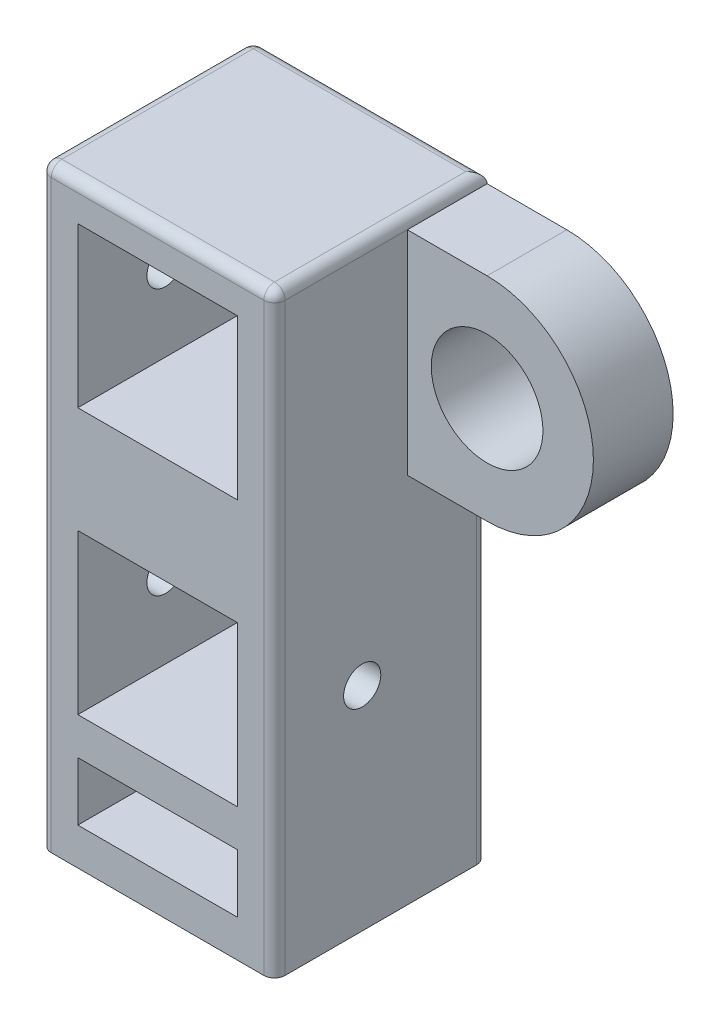
ISO-10303-21;
HEADER;
FILE_DESCRIPTION(('STEP AP214'),'2;1');
FILE_NAME('part.step','',(''),(''),'','','');
FILE_SCHEMA(('AUTOMOTIVE_DESIGN { 1 0 10303 214 1 1 1 1 }'));
ENDSEC;
DATA;
#1=APPLICATION_CONTEXT('core data for automotive mechanical design processes');
#2=APPLICATION_PROTOCOL_DEFINITION('international standard','automotive_design',2000,#1);
#3=PRODUCT_CONTEXT('',#1,'mechanical');
#4=PRODUCT('Part','Part','',(#3));
#5=PRODUCT_RELATED_PRODUCT_CATEGORY('part','',(#4));
#6=PRODUCT_DEFINITION_FORMATION('','',#4);
#7=PRODUCT_DEFINITION_CONTEXT('part definition',#1,'design');
#8=PRODUCT_DEFINITION('design','',#6,#7);
#9=PRODUCT_DEFINITION_SHAPE('','',#8);
#10=(LENGTH_UNIT() NAMED_UNIT(*) SI_UNIT(.MILLI.,.METRE.));
#11=(NAMED_UNIT(*) PLANE_ANGLE_UNIT() SI_UNIT($,.RADIAN.));
#12=(NAMED_UNIT(*) SI_UNIT($,.STERADIAN.) SOLID_ANGLE_UNIT());
#13=UNCERTAINTY_MEASURE_WITH_UNIT(LENGTH_MEASURE(1.E-05),#10,'distance_accuracy_value','');
#14=(GEOMETRIC_REPRESENTATION_CONTEXT(3) GLOBAL_UNCERTAINTY_ASSIGNED_CONTEXT((#13)) GLOBAL_UNIT_ASSIGNED_CONTEXT((#10,
#11,#12)) REPRESENTATION_CONTEXT('',''));
#15=CARTESIAN_POINT('',(0.,0.,0.));
#16=DIRECTION('',(0.,0.,1.));
#17=DIRECTION('',(1.,0.,0.));
#18=AXIS2_PLACEMENT_3D('',#15,#16,#17);
#19=CARTESIAN_POINT('',(-3.09617260414297,42.3339477261805,20.));
#20=DIRECTION('',(-1.,0.,0.));
#21=DIRECTION('',(0.,-1.,0.));
#22=AXIS2_PLACEMENT_3D('',#19,#20,#21);
#23=PLANE('',#22);
#24=CARTESIAN_POINT('',(-3.09617260414296,6.33394772618054,11.75));
#25=DIRECTION('',(1.,0.,0.));
#26=DIRECTION('',(0.,1.,0.));
#27=AXIS2_PLACEMENT_3D('',#24,#25,#26);
#28=CIRCLE('',#27,1.75);
#29=CARTESIAN_POINT('',(-3.09617260414296,8.08394772618054,11.75));
#30=VERTEX_POINT('',#29);
#31=EDGE_CURVE('E350',#30,#30,#28,.T.);
#32=ORIENTED_EDGE('',*,*,#31,.F.);
#33=EDGE_LOOP('',(#32));
#34=FACE_BOUND('',#33,.T.);
#35=DIRECTION('',(0.,0.,-1.));
#36=VECTOR('',#35,1.);
#37=CARTESIAN_POINT('',(-3.09617260414296,-13.6660522738195,20.));
#38=LINE('',#37,#36);
#39=CARTESIAN_POINT('',(-3.09617260414296,-13.6660522738195,19.));
#40=VERTEX_POINT('',#39);
#41=CARTESIAN_POINT('',(-3.09617260414296,-13.6660522738195,1.));
#42=VERTEX_POINT('',#41);
#43=EDGE_CURVE('E448',#40,#42,#38,.T.);
#44=ORIENTED_EDGE('',*,*,#43,.T.);
#45=DIRECTION('',(0.,1.,0.));
#46=VECTOR('',#45,1.);
#47=CARTESIAN_POINT('',(-3.09617260414297,42.3339477261805,1.));
#48=LINE('',#47,#46);
#49=CARTESIAN_POINT('',(-3.09617260414296,21.3339477261805,1.));
#50=VERTEX_POINT('',#49);
#51=EDGE_CURVE('E269',#42,#50,#48,.T.);
#52=ORIENTED_EDGE('',*,*,#51,.T.);
#53=DIRECTION('',(0.,0.,-1.));
#54=VECTOR('',#53,1.);
#55=CARTESIAN_POINT('',(-3.09617260414296,21.3339477261805,7.5));
#56=LINE('',#55,#54);
#57=CARTESIAN_POINT('',(-3.09617260414296,21.3339477261805,7.5));
#58=VERTEX_POINT('',#57);
#59=EDGE_CURVE('E221',#58,#50,#56,.T.);
#60=ORIENTED_EDGE('',*,*,#59,.F.);
#61=DIRECTION('',(0.,1.,0.));
#62=VECTOR('',#61,1.);
#63=CARTESIAN_POINT('',(-3.09617260414297,41.3339477261805,7.5));
#64=LINE('',#63,#62);
#65=CARTESIAN_POINT('',(-3.09617260414297,41.3339477261805,7.5));
#66=VERTEX_POINT('',#65);
#67=EDGE_CURVE('E231',#58,#66,#64,.T.);
#68=ORIENTED_EDGE('',*,*,#67,.T.);
#69=DIRECTION('',(0.,0.,-1.));
#70=VECTOR('',#69,1.);
#71=CARTESIAN_POINT('',(-3.09617260414297,41.3339477261805,20.));
#72=LINE('',#71,#70);
#73=CARTESIAN_POINT('',(-3.09617260414297,41.3339477261805,19.));
#74=VERTEX_POINT('',#73);
#75=EDGE_CURVE('E264',#66,#74,#72,.F.);
#76=ORIENTED_EDGE('',*,*,#75,.T.);
#77=DIRECTION('',(0.,1.,0.));
#78=VECTOR('',#77,1.);
#79=CARTESIAN_POINT('',(-3.09617260414296,-13.6660522738195,19.));
#80=LINE('',#79,#78);
#81=EDGE_CURVE('E266',#74,#40,#80,.F.);
#82=ORIENTED_EDGE('',*,*,#81,.T.);
#83=EDGE_LOOP('',(#44,#52,#60,#68,#76,#82));
#84=FACE_BOUND('',#83,.T.);
#85=ADVANCED_FACE('F35',(#34,#84),#23,.F.);
#86=CARTESIAN_POINT('',(0.,0.,20.));
#87=DIRECTION('',(0.,0.,1.));
#88=DIRECTION('',(1.,0.,0.));
#89=AXIS2_PLACEMENT_3D('',#86,#87,#88);
#90=PLANE('',#89);
#91=DIRECTION('',(1.,0.,0.));
#92=VECTOR('',#91,1.);
#93=CARTESIAN_POINT('',(-25.096172604143,-13.6660522738195,20.));
#94=LINE('',#93,#92);
#95=CARTESIAN_POINT('',(-24.096172604143,-13.6660522738195,20.));
#96=VERTEX_POINT('',#95);
#97=CARTESIAN_POINT('',(-4.09617260414296,-13.6660522738195,20.));
#98=VERTEX_POINT('',#97);
#99=EDGE_CURVE('E444',#96,#98,#94,.T.);
#100=ORIENTED_EDGE('',*,*,#99,.T.);
#101=DIRECTION('',(0.,1.,0.));
#102=VECTOR('',#101,1.);
#103=CARTESIAN_POINT('',(-4.09617260414297,42.3339477261805,20.));
#104=LINE('',#103,#102);
#105=CARTESIAN_POINT('',(-4.09617260414297,41.3339477261805,20.));
#106=VERTEX_POINT('',#105);
#107=EDGE_CURVE('E292',#98,#106,#104,.T.);
#108=ORIENTED_EDGE('',*,*,#107,.T.);
#109=DIRECTION('',(-1.,0.,0.));
#110=VECTOR('',#109,1.);
#111=CARTESIAN_POINT('',(-25.096172604143,41.3339477261805,20.));
#112=LINE('',#111,#110);
#113=CARTESIAN_POINT('',(-24.096172604143,41.3339477261805,20.));
#114=VERTEX_POINT('',#113);
#115=EDGE_CURVE('E288',#106,#114,#112,.T.);
#116=ORIENTED_EDGE('',*,*,#115,.T.);
#117=DIRECTION('',(0.,-1.,0.));
#118=VECTOR('',#117,1.);
#119=CARTESIAN_POINT('',(-24.096172604143,-13.6660522738195,20.));
#120=LINE('',#119,#118);
#121=EDGE_CURVE('E290',#114,#96,#120,.T.);
#122=ORIENTED_EDGE('',*,*,#121,.T.);
#123=EDGE_LOOP('',(#100,#108,#116,#122));
#124=FACE_BOUND('',#123,.T.);
#125=DIRECTION('',(0.,-1.,0.));
#126=VECTOR('',#125,1.);
#127=CARTESIAN_POINT('',(-21.596172604143,-4.66605227381946,20.));
#128=LINE('',#127,#126);
#129=CARTESIAN_POINT('',(-21.596172604143,-4.66605227381946,20.));
#130=VERTEX_POINT('',#129);
#131=CARTESIAN_POINT('',(-21.596172604143,-10.1660522738195,20.));
#132=VERTEX_POINT('',#131);
#133=EDGE_CURVE('E249',#130,#132,#128,.T.);
#134=ORIENTED_EDGE('',*,*,#133,.F.);
#135=DIRECTION('',(-1.,0.,0.));
#136=VECTOR('',#135,1.);
#137=CARTESIAN_POINT('',(-21.596172604143,-4.66605227381946,20.));
#138=LINE('',#137,#136);
#139=CARTESIAN_POINT('',(-6.59617260414296,-4.66605227381946,20.));
#140=VERTEX_POINT('',#139);
#141=EDGE_CURVE('E522',#140,#130,#138,.T.);
#142=ORIENTED_EDGE('',*,*,#141,.F.);
#143=DIRECTION('',(0.,1.,0.));
#144=VECTOR('',#143,1.);
#145=CARTESIAN_POINT('',(-6.59617260414296,-4.66605227381946,20.));
#146=LINE('',#145,#144);
#147=CARTESIAN_POINT('',(-6.59617260414296,-10.1660522738195,20.));
#148=VERTEX_POINT('',#147);
#149=EDGE_CURVE('E531',#148,#140,#146,.T.);
#150=ORIENTED_EDGE('',*,*,#149,.F.);
#151=DIRECTION('',(1.,0.,0.));
#152=VECTOR('',#151,1.);
#153=CARTESIAN_POINT('',(-21.596172604143,-10.1660522738195,20.));
#154=LINE('',#153,#152);
#155=EDGE_CURVE('E534',#132,#148,#154,.T.);
#156=ORIENTED_EDGE('',*,*,#155,.F.);
#157=EDGE_LOOP('',(#134,#142,#150,#156));
#158=FACE_BOUND('',#157,.T.);
#159=DIRECTION('',(0.,-1.,0.));
#160=VECTOR('',#159,1.);
#161=CARTESIAN_POINT('',(-21.596172604143,13.8339477261805,20.));
#162=LINE('',#161,#160);
#163=CARTESIAN_POINT('',(-21.596172604143,13.8339477261805,20.));
#164=VERTEX_POINT('',#163);
#165=CARTESIAN_POINT('',(-21.596172604143,-1.16605227381946,20.));
#166=VERTEX_POINT('',#165);
#167=EDGE_CURVE('E509',#164,#166,#162,.T.);
#168=ORIENTED_EDGE('',*,*,#167,.F.);
#169=DIRECTION('',(-1.,0.,0.));
#170=VECTOR('',#169,1.);
#171=CARTESIAN_POINT('',(-21.596172604143,13.8339477261805,20.));
#172=LINE('',#171,#170);
#173=CARTESIAN_POINT('',(-6.59617260414296,13.8339477261805,20.));
#174=VERTEX_POINT('',#173);
#175=EDGE_CURVE('E494',#174,#164,#172,.T.);
#176=ORIENTED_EDGE('',*,*,#175,.F.);
#177=DIRECTION('',(0.,1.,0.));
#178=VECTOR('',#177,1.);
#179=CARTESIAN_POINT('',(-6.59617260414296,13.8339477261805,20.));
#180=LINE('',#179,#178);
#181=CARTESIAN_POINT('',(-6.59617260414296,-1.16605227381946,20.));
#182=VERTEX_POINT('',#181);
#183=EDGE_CURVE('E503',#182,#174,#180,.T.);
#184=ORIENTED_EDGE('',*,*,#183,.F.);
#185=DIRECTION('',(1.,0.,0.));
#186=VECTOR('',#185,1.);
#187=CARTESIAN_POINT('',(-21.596172604143,-1.16605227381946,20.));
#188=LINE('',#187,#186);
#189=EDGE_CURVE('E506',#166,#182,#188,.T.);
#190=ORIENTED_EDGE('',*,*,#189,.F.);
#191=EDGE_LOOP('',(#168,#176,#184,#190));
#192=FACE_BOUND('',#191,.T.);
#193=DIRECTION('',(1.,0.,0.));
#194=VECTOR('',#193,1.);
#195=CARTESIAN_POINT('',(-21.596172604143,23.8339477261805,20.));
#196=LINE('',#195,#194);
#197=CARTESIAN_POINT('',(-21.596172604143,23.8339477261805,20.));
#198=VERTEX_POINT('',#197);
#199=CARTESIAN_POINT('',(-6.59617260414296,23.8339477261805,20.));
#200=VERTEX_POINT('',#199);
#201=EDGE_CURVE('E485',#198,#200,#196,.T.);
#202=ORIENTED_EDGE('',*,*,#201,.F.);
#203=DIRECTION('',(0.,-1.,0.));
#204=VECTOR('',#203,1.);
#205=CARTESIAN_POINT('',(-21.596172604143,38.8339477261805,20.));
#206=LINE('',#205,#204);
#207=CARTESIAN_POINT('',(-21.596172604143,38.8339477261805,20.));
#208=VERTEX_POINT('',#207);
#209=EDGE_CURVE('E470',#208,#198,#206,.T.);
#210=ORIENTED_EDGE('',*,*,#209,.F.);
#211=DIRECTION('',(-1.,0.,0.));
#212=VECTOR('',#211,1.);
#213=CARTESIAN_POINT('',(-21.596172604143,38.8339477261805,20.));
#214=LINE('',#213,#212);
#215=CARTESIAN_POINT('',(-6.59617260414297,38.8339477261805,20.));
#216=VERTEX_POINT('',#215);
#217=EDGE_CURVE('E466',#216,#208,#214,.T.);
#218=ORIENTED_EDGE('',*,*,#217,.F.);
#219=DIRECTION('',(0.,1.,0.));
#220=VECTOR('',#219,1.);
#221=CARTESIAN_POINT('',(-6.59617260414297,38.8339477261805,20.));
#222=LINE('',#221,#220);
#223=EDGE_CURVE('E482',#200,#216,#222,.T.);
#224=ORIENTED_EDGE('',*,*,#223,.F.);
#225=EDGE_LOOP('',(#202,#210,#218,#224));
#226=FACE_BOUND('',#225,.T.);
#227=ADVANCED_FACE('F363',(#124,#158,#192,#226),#90,.T.);
#228=CARTESIAN_POINT('',(0.,0.,0.));
#229=DIRECTION('',(0.,0.,1.));
#230=DIRECTION('',(1.,0.,0.));
#231=AXIS2_PLACEMENT_3D('',#228,#229,#230);
#232=PLANE('',#231);
#233=DIRECTION('',(-1.,0.,0.));
#234=VECTOR('',#233,1.);
#235=CARTESIAN_POINT('',(-3.09617260414296,21.3339477261805,0.));
#236=LINE('',#235,#234);
#237=CARTESIAN_POINT('',(4.40382739585704,21.3339477261805,0.));
#238=VERTEX_POINT('',#237);
#239=CARTESIAN_POINT('',(-4.09617260414296,21.3339477261805,0.));
#240=VERTEX_POINT('',#239);
#241=EDGE_CURVE('E216',#238,#240,#236,.T.);
#242=ORIENTED_EDGE('',*,*,#241,.T.);
#243=DIRECTION('',(0.,1.,0.));
#244=VECTOR('',#243,1.);
#245=CARTESIAN_POINT('',(-4.09617260414296,0.,0.));
#246=LINE('',#245,#244);
#247=CARTESIAN_POINT('',(-4.09617260414296,-13.6660522738195,0.));
#248=VERTEX_POINT('',#247);
#249=EDGE_CURVE('E278',#240,#248,#246,.F.);
#250=ORIENTED_EDGE('',*,*,#249,.T.);
#251=DIRECTION('',(1.,0.,0.));
#252=VECTOR('',#251,1.);
#253=CARTESIAN_POINT('',(-25.096172604143,-13.6660522738195,0.));
#254=LINE('',#253,#252);
#255=CARTESIAN_POINT('',(-24.096172604143,-13.6660522738195,0.));
#256=VERTEX_POINT('',#255);
#257=EDGE_CURVE('E453',#256,#248,#254,.T.);
#258=ORIENTED_EDGE('',*,*,#257,.F.);
#259=DIRECTION('',(0.,-1.,0.));
#260=VECTOR('',#259,1.);
#261=CARTESIAN_POINT('',(-24.096172604143,0.,0.));
#262=LINE('',#261,#260);
#263=CARTESIAN_POINT('',(-24.096172604143,41.3339477261805,0.));
#264=VERTEX_POINT('',#263);
#265=EDGE_CURVE('E274',#256,#264,#262,.F.);
#266=ORIENTED_EDGE('',*,*,#265,.T.);
#267=DIRECTION('',(-1.,0.,0.));
#268=VECTOR('',#267,1.);
#269=CARTESIAN_POINT('',(0.,41.3339477261805,0.));
#270=LINE('',#269,#268);
#271=CARTESIAN_POINT('',(-3.09617260414297,41.3339477261805,0.));
#272=VERTEX_POINT('',#271);
#273=EDGE_CURVE('E272',#264,#272,#270,.F.);
#274=ORIENTED_EDGE('',*,*,#273,.T.);
#275=DIRECTION('',(1.,0.,0.));
#276=VECTOR('',#275,1.);
#277=CARTESIAN_POINT('',(4.40382739585704,41.3339477261805,0.));
#278=LINE('',#277,#276);
#279=CARTESIAN_POINT('',(4.40382739585704,41.3339477261805,0.));
#280=VERTEX_POINT('',#279);
#281=EDGE_CURVE('E235',#272,#280,#278,.T.);
#282=ORIENTED_EDGE('',*,*,#281,.T.);
#283=CARTESIAN_POINT('',(4.40382739585704,31.3339477261805,0.));
#284=DIRECTION('',(0.,0.,-1.));
#285=DIRECTION('',(-1.,0.,0.));
#286=AXIS2_PLACEMENT_3D('',#283,#284,#285);
#287=CIRCLE('',#286,10.);
#288=EDGE_CURVE('E245',#280,#238,#287,.T.);
#289=ORIENTED_EDGE('',*,*,#288,.T.);
#290=EDGE_LOOP('',(#242,#250,#258,#266,#274,#282,#289));
#291=FACE_BOUND('',#290,.T.);
#292=DIRECTION('',(0.,-1.,0.));
#293=VECTOR('',#292,1.);
#294=CARTESIAN_POINT('',(-21.596172604143,38.8339477261805,0.));
#295=LINE('',#294,#293);
#296=CARTESIAN_POINT('',(-21.596172604143,38.8339477261805,0.));
#297=VERTEX_POINT('',#296);
#298=CARTESIAN_POINT('',(-21.596172604143,23.8339477261805,0.));
#299=VERTEX_POINT('',#298);
#300=EDGE_CURVE('E477',#297,#299,#295,.T.);
#301=ORIENTED_EDGE('',*,*,#300,.T.);
#302=DIRECTION('',(1.,0.,0.));
#303=VECTOR('',#302,1.);
#304=CARTESIAN_POINT('',(-21.596172604143,23.8339477261805,0.));
#305=LINE('',#304,#303);
#306=CARTESIAN_POINT('',(-6.59617260414296,23.8339477261805,0.));
#307=VERTEX_POINT('',#306);
#308=EDGE_CURVE('E474',#299,#307,#305,.T.);
#309=ORIENTED_EDGE('',*,*,#308,.T.);
#310=DIRECTION('',(0.,1.,0.));
#311=VECTOR('',#310,1.);
#312=CARTESIAN_POINT('',(-6.59617260414297,38.8339477261805,0.));
#313=LINE('',#312,#311);
#314=CARTESIAN_POINT('',(-6.59617260414297,38.8339477261805,0.));
#315=VERTEX_POINT('',#314);
#316=EDGE_CURVE('E471',#307,#315,#313,.T.);
#317=ORIENTED_EDGE('',*,*,#316,.T.);
#318=DIRECTION('',(-1.,0.,0.));
#319=VECTOR('',#318,1.);
#320=CARTESIAN_POINT('',(-21.596172604143,38.8339477261805,0.));
#321=LINE('',#320,#319);
#322=EDGE_CURVE('E467',#315,#297,#321,.T.);
#323=ORIENTED_EDGE('',*,*,#322,.T.);
#324=EDGE_LOOP('',(#301,#309,#317,#323));
#325=FACE_BOUND('',#324,.T.);
#326=CARTESIAN_POINT('',(4.40382739585704,31.3339477261805,0.));
#327=DIRECTION('',(0.,0.,-1.));
#328=DIRECTION('',(-1.,0.,0.));
#329=AXIS2_PLACEMENT_3D('',#326,#327,#328);
#330=CIRCLE('',#329,5.25);
#331=CARTESIAN_POINT('',(-0.846172604142958,31.3339477261805,0.));
#332=VERTEX_POINT('',#331);
#333=EDGE_CURVE('E240',#332,#332,#330,.T.);
#334=ORIENTED_EDGE('',*,*,#333,.F.);
#335=EDGE_LOOP('',(#334));
#336=FACE_BOUND('',#335,.T.);
#337=ADVANCED_FACE('F360',(#291,#325,#336),#232,.F.);
#338=CARTESIAN_POINT('',(-25.096172604143,42.3339477261805,20.));
#339=DIRECTION('',(1.,0.,0.));
#340=DIRECTION('',(0.,0.,-1.));
#341=AXIS2_PLACEMENT_3D('',#338,#339,#340);
#342=PLANE('',#341);
#343=CARTESIAN_POINT('',(-25.096172604143,6.33394772618054,11.75));
#344=DIRECTION('',(-1.,0.,0.));
#345=DIRECTION('',(0.,0.,1.));
#346=AXIS2_PLACEMENT_3D('',#343,#344,#345);
#347=CIRCLE('',#346,1.75);
#348=CARTESIAN_POINT('',(-25.096172604143,6.33394772618054,13.5));
#349=VERTEX_POINT('',#348);
#350=EDGE_CURVE('E340',#349,#349,#347,.T.);
#351=ORIENTED_EDGE('',*,*,#350,.F.);
#352=EDGE_LOOP('',(#351));
#353=FACE_BOUND('',#352,.T.);
#354=CARTESIAN_POINT('',(-25.096172604143,31.3339477261805,11.75));
#355=DIRECTION('',(-1.,0.,0.));
#356=DIRECTION('',(0.,0.,1.));
#357=AXIS2_PLACEMENT_3D('',#354,#355,#356);
#358=CIRCLE('',#357,1.75);
#359=CARTESIAN_POINT('',(-25.096172604143,31.3339477261805,13.5));
#360=VERTEX_POINT('',#359);
#361=EDGE_CURVE('E337',#360,#360,#358,.T.);
#362=ORIENTED_EDGE('',*,*,#361,.F.);
#363=EDGE_LOOP('',(#362));
#364=FACE_BOUND('',#363,.T.);
#365=DIRECTION('',(0.,0.,-1.));
#366=VECTOR('',#365,1.);
#367=CARTESIAN_POINT('',(-25.096172604143,41.3339477261805,20.));
#368=LINE('',#367,#366);
#369=CARTESIAN_POINT('',(-25.096172604143,41.3339477261805,19.));
#370=VERTEX_POINT('',#369);
#371=CARTESIAN_POINT('',(-25.096172604143,41.3339477261805,1.));
#372=VERTEX_POINT('',#371);
#373=EDGE_CURVE('E295',#370,#372,#368,.T.);
#374=ORIENTED_EDGE('',*,*,#373,.T.);
#375=DIRECTION('',(0.,-1.,0.));
#376=VECTOR('',#375,1.);
#377=CARTESIAN_POINT('',(-25.096172604143,42.3339477261805,1.));
#378=LINE('',#377,#376);
#379=CARTESIAN_POINT('',(-25.096172604143,-13.6660522738195,1.));
#380=VERTEX_POINT('',#379);
#381=EDGE_CURVE('E299',#372,#380,#378,.T.);
#382=ORIENTED_EDGE('',*,*,#381,.T.);
#383=DIRECTION('',(0.,0.,-1.));
#384=VECTOR('',#383,1.);
#385=CARTESIAN_POINT('',(-25.096172604143,-13.6660522738195,20.));
#386=LINE('',#385,#384);
#387=CARTESIAN_POINT('',(-25.096172604143,-13.6660522738195,19.));
#388=VERTEX_POINT('',#387);
#389=EDGE_CURVE('E267',#388,#380,#386,.T.);
#390=ORIENTED_EDGE('',*,*,#389,.F.);
#391=DIRECTION('',(0.,-1.,0.));
#392=VECTOR('',#391,1.);
#393=CARTESIAN_POINT('',(-25.096172604143,42.3339477261805,19.));
#394=LINE('',#393,#392);
#395=EDGE_CURVE('E297',#388,#370,#394,.F.);
#396=ORIENTED_EDGE('',*,*,#395,.T.);
#397=EDGE_LOOP('',(#374,#382,#390,#396));
#398=FACE_BOUND('',#397,.T.);
#399=ADVANCED_FACE('F362',(#353,#364,#398),#342,.F.);
#400=CARTESIAN_POINT('',(-25.096172604143,-13.6660522738195,20.));
#401=DIRECTION('',(0.,1.,0.));
#402=DIRECTION('',(0.,0.,1.));
#403=AXIS2_PLACEMENT_3D('',#400,#401,#402);
#404=PLANE('',#403);
#405=ORIENTED_EDGE('',*,*,#257,.T.);
#406=CARTESIAN_POINT('',(-4.09617260414296,-13.6660522738195,1.));
#407=DIRECTION('',(0.,1.,0.));
#408=DIRECTION('',(0.,0.,1.));
#409=AXIS2_PLACEMENT_3D('',#406,#407,#408);
#410=CIRCLE('',#409,1.);
#411=EDGE_CURVE('E286',#248,#42,#410,.F.);
#412=ORIENTED_EDGE('',*,*,#411,.T.);
#413=ORIENTED_EDGE('',*,*,#43,.F.);
#414=CARTESIAN_POINT('',(-4.09617260414296,-13.6660522738195,19.));
#415=DIRECTION('',(0.,1.,0.));
#416=DIRECTION('',(0.,0.,1.));
#417=AXIS2_PLACEMENT_3D('',#414,#415,#416);
#418=CIRCLE('',#417,1.);
#419=EDGE_CURVE('E284',#40,#98,#418,.F.);
#420=ORIENTED_EDGE('',*,*,#419,.T.);
#421=ORIENTED_EDGE('',*,*,#99,.F.);
#422=CARTESIAN_POINT('',(-24.096172604143,-13.6660522738195,19.));
#423=DIRECTION('',(0.,1.,0.));
#424=DIRECTION('',(0.,0.,1.));
#425=AXIS2_PLACEMENT_3D('',#422,#423,#424);
#426=CIRCLE('',#425,1.);
#427=EDGE_CURVE('E280',#96,#388,#426,.F.);
#428=ORIENTED_EDGE('',*,*,#427,.T.);
#429=ORIENTED_EDGE('',*,*,#389,.T.);
#430=CARTESIAN_POINT('',(-24.096172604143,-13.6660522738195,1.));
#431=DIRECTION('',(0.,1.,0.));
#432=DIRECTION('',(0.,0.,1.));
#433=AXIS2_PLACEMENT_3D('',#430,#431,#432);
#434=CIRCLE('',#433,1.);
#435=EDGE_CURVE('E282',#380,#256,#434,.F.);
#436=ORIENTED_EDGE('',*,*,#435,.T.);
#437=EDGE_LOOP('',(#405,#412,#413,#420,#421,#428,#429,#436));
#438=FACE_BOUND('',#437,.T.);
#439=ADVANCED_FACE('F371',(#438),#404,.F.);
#440=CARTESIAN_POINT('',(-25.096172604143,42.3339477261805,20.));
#441=DIRECTION('',(0.,-1.,0.));
#442=DIRECTION('',(0.,0.,-1.));
#443=AXIS2_PLACEMENT_3D('',#440,#441,#442);
#444=PLANE('',#443);
#445=DIRECTION('',(0.,0.,-1.));
#446=VECTOR('',#445,1.);
#447=CARTESIAN_POINT('',(-24.096172604143,42.3339477261805,20.));
#448=LINE('',#447,#446);
#449=CARTESIAN_POINT('',(-24.096172604143,42.3339477261805,1.));
#450=VERTEX_POINT('',#449);
#451=CARTESIAN_POINT('',(-24.096172604143,42.3339477261805,19.));
#452=VERTEX_POINT('',#451);
#453=EDGE_CURVE('E301',#450,#452,#448,.F.);
#454=ORIENTED_EDGE('',*,*,#453,.T.);
#455=DIRECTION('',(-1.,0.,0.));
#456=VECTOR('',#455,1.);
#457=CARTESIAN_POINT('',(-3.09617260414297,42.3339477261805,19.));
#458=LINE('',#457,#456);
#459=CARTESIAN_POINT('',(-4.09617260414297,42.3339477261805,19.));
#460=VERTEX_POINT('',#459);
#461=EDGE_CURVE('E44',#452,#460,#458,.F.);
#462=ORIENTED_EDGE('',*,*,#461,.T.);
#463=DIRECTION('',(0.,0.,-1.));
#464=VECTOR('',#463,1.);
#465=CARTESIAN_POINT('',(-4.09617260414297,42.3339477261805,20.));
#466=LINE('',#465,#464);
#467=CARTESIAN_POINT('',(-4.09617260414297,42.3339477261805,1.));
#468=VERTEX_POINT('',#467);
#469=EDGE_CURVE('E60',#460,#468,#466,.T.);
#470=ORIENTED_EDGE('',*,*,#469,.T.);
#471=DIRECTION('',(-1.,0.,0.));
#472=VECTOR('',#471,1.);
#473=CARTESIAN_POINT('',(-25.096172604143,42.3339477261805,1.));
#474=LINE('',#473,#472);
#475=EDGE_CURVE('E303',#468,#450,#474,.T.);
#476=ORIENTED_EDGE('',*,*,#475,.T.);
#477=EDGE_LOOP('',(#454,#462,#470,#476));
#478=FACE_BOUND('',#477,.T.);
#479=ADVANCED_FACE('F388',(#478),#444,.F.);
#480=CARTESIAN_POINT('',(-21.596172604143,38.8339477261805,20.));
#481=DIRECTION('',(1.,0.,0.));
#482=DIRECTION('',(0.,1.,0.));
#483=AXIS2_PLACEMENT_3D('',#480,#481,#482);
#484=PLANE('',#483);
#485=CARTESIAN_POINT('',(-21.596172604143,31.3339477261805,11.75));
#486=DIRECTION('',(1.,0.,0.));
#487=DIRECTION('',(0.,1.,0.));
#488=AXIS2_PLACEMENT_3D('',#485,#486,#487);
#489=CIRCLE('',#488,1.75);
#490=CARTESIAN_POINT('',(-21.596172604143,33.0839477261805,11.75));
#491=VERTEX_POINT('',#490);
#492=EDGE_CURVE('E309',#491,#491,#489,.T.);
#493=ORIENTED_EDGE('',*,*,#492,.F.);
#494=EDGE_LOOP('',(#493));
#495=FACE_BOUND('',#494,.T.);
#496=ORIENTED_EDGE('',*,*,#300,.F.);
#497=DIRECTION('',(0.,0.,-1.));
#498=VECTOR('',#497,1.);
#499=CARTESIAN_POINT('',(-21.596172604143,38.8339477261805,20.));
#500=LINE('',#499,#498);
#501=EDGE_CURVE('E463',#208,#297,#500,.T.);
#502=ORIENTED_EDGE('',*,*,#501,.F.);
#503=ORIENTED_EDGE('',*,*,#209,.T.);
#504=DIRECTION('',(0.,0.,-1.));
#505=VECTOR('',#504,1.);
#506=CARTESIAN_POINT('',(-21.596172604143,23.8339477261805,20.));
#507=LINE('',#506,#505);
#508=EDGE_CURVE('E455',#198,#299,#507,.T.);
#509=ORIENTED_EDGE('',*,*,#508,.T.);
#510=EDGE_LOOP('',(#496,#502,#503,#509));
#511=FACE_BOUND('',#510,.T.);
#512=ADVANCED_FACE('F606',(#495,#511),#484,.T.);
#513=CARTESIAN_POINT('',(-21.596172604143,23.8339477261805,20.));
#514=DIRECTION('',(0.,1.,0.));
#515=DIRECTION('',(0.,0.,1.));
#516=AXIS2_PLACEMENT_3D('',#513,#514,#515);
#517=PLANE('',#516);
#518=ORIENTED_EDGE('',*,*,#308,.F.);
#519=ORIENTED_EDGE('',*,*,#508,.F.);
#520=ORIENTED_EDGE('',*,*,#201,.T.);
#521=DIRECTION('',(0.,0.,-1.));
#522=VECTOR('',#521,1.);
#523=CARTESIAN_POINT('',(-6.59617260414296,23.8339477261805,20.));
#524=LINE('',#523,#522);
#525=EDGE_CURVE('E459',#200,#307,#524,.T.);
#526=ORIENTED_EDGE('',*,*,#525,.T.);
#527=EDGE_LOOP('',(#518,#519,#520,#526));
#528=FACE_BOUND('',#527,.T.);
#529=ADVANCED_FACE('F602',(#528),#517,.T.);
#530=CARTESIAN_POINT('',(-6.59617260414297,38.8339477261805,20.));
#531=DIRECTION('',(-1.,0.,0.));
#532=DIRECTION('',(0.,-1.,0.));
#533=AXIS2_PLACEMENT_3D('',#530,#531,#532);
#534=PLANE('',#533);
#535=ORIENTED_EDGE('',*,*,#316,.F.);
#536=ORIENTED_EDGE('',*,*,#525,.F.);
#537=ORIENTED_EDGE('',*,*,#223,.T.);
#538=DIRECTION('',(0.,0.,-1.));
#539=VECTOR('',#538,1.);
#540=CARTESIAN_POINT('',(-6.59617260414297,38.8339477261805,20.));
#541=LINE('',#540,#539);
#542=EDGE_CURVE('E461',#216,#315,#541,.T.);
#543=ORIENTED_EDGE('',*,*,#542,.T.);
#544=EDGE_LOOP('',(#535,#536,#537,#543));
#545=FACE_BOUND('',#544,.T.);
#546=ADVANCED_FACE('F598',(#545),#534,.T.);
#547=CARTESIAN_POINT('',(-21.596172604143,38.8339477261805,20.));
#548=DIRECTION('',(0.,-1.,0.));
#549=DIRECTION('',(0.,0.,-1.));
#550=AXIS2_PLACEMENT_3D('',#547,#548,#549);
#551=PLANE('',#550);
#552=ORIENTED_EDGE('',*,*,#322,.F.);
#553=ORIENTED_EDGE('',*,*,#542,.F.);
#554=ORIENTED_EDGE('',*,*,#217,.T.);
#555=ORIENTED_EDGE('',*,*,#501,.T.);
#556=EDGE_LOOP('',(#552,#553,#554,#555));
#557=FACE_BOUND('',#556,.T.);
#558=ADVANCED_FACE('F595',(#557),#551,.T.);
#559=CARTESIAN_POINT('',(-21.596172604143,13.8339477261805,-21.2132034355964));
#560=DIRECTION('',(-1.,0.,0.));
#561=DIRECTION('',(0.,-1.,0.));
#562=AXIS2_PLACEMENT_3D('',#559,#560,#561);
#563=PLANE('',#562);
#564=CARTESIAN_POINT('',(-21.596172604143,6.33394772618054,11.75));
#565=DIRECTION('',(-1.,0.,0.));
#566=DIRECTION('',(0.,-1.,0.));
#567=AXIS2_PLACEMENT_3D('',#564,#565,#566);
#568=CIRCLE('',#567,1.75);
#569=CARTESIAN_POINT('',(-21.596172604143,4.58394772618054,11.75));
#570=VERTEX_POINT('',#569);
#571=EDGE_CURVE('E338',#570,#570,#568,.T.);
#572=ORIENTED_EDGE('',*,*,#571,.T.);
#573=EDGE_LOOP('',(#572));
#574=FACE_BOUND('',#573,.T.);
#575=DIRECTION('',(0.,1.,0.));
#576=VECTOR('',#575,1.);
#577=CARTESIAN_POINT('',(-21.596172604143,13.8339477261805,4.5));
#578=LINE('',#577,#576);
#579=CARTESIAN_POINT('',(-21.596172604143,-1.16605227381946,4.5));
#580=VERTEX_POINT('',#579);
#581=CARTESIAN_POINT('',(-21.596172604143,13.8339477261805,4.5));
#582=VERTEX_POINT('',#581);
#583=EDGE_CURVE('E489',#580,#582,#578,.T.);
#584=ORIENTED_EDGE('',*,*,#583,.T.);
#585=DIRECTION('',(0.,0.,1.));
#586=VECTOR('',#585,1.);
#587=CARTESIAN_POINT('',(-21.596172604143,13.8339477261805,-21.2132034355964));
#588=LINE('',#587,#586);
#589=EDGE_CURVE('E498',#582,#164,#588,.T.);
#590=ORIENTED_EDGE('',*,*,#589,.T.);
#591=ORIENTED_EDGE('',*,*,#167,.T.);
#592=DIRECTION('',(0.,0.,1.));
#593=VECTOR('',#592,1.);
#594=CARTESIAN_POINT('',(-21.596172604143,-1.16605227381946,-21.2132034355964));
#595=LINE('',#594,#593);
#596=EDGE_CURVE('E490',#580,#166,#595,.T.);
#597=ORIENTED_EDGE('',*,*,#596,.F.);
#598=EDGE_LOOP('',(#584,#590,#591,#597));
#599=FACE_BOUND('',#598,.T.);
#600=ADVANCED_FACE('F586',(#574,#599),#563,.F.);
#601=CARTESIAN_POINT('',(-21.596172604143,13.8339477261805,-21.2132034355964));
#602=DIRECTION('',(0.,1.,0.));
#603=DIRECTION('',(0.,0.,1.));
#604=AXIS2_PLACEMENT_3D('',#601,#602,#603);
#605=PLANE('',#604);
#606=DIRECTION('',(1.,0.,0.));
#607=VECTOR('',#606,1.);
#608=CARTESIAN_POINT('',(-21.596172604143,13.8339477261805,4.5));
#609=LINE('',#608,#607);
#610=CARTESIAN_POINT('',(-6.59617260414296,13.8339477261805,4.5));
#611=VERTEX_POINT('',#610);
#612=EDGE_CURVE('E513',#582,#611,#609,.T.);
#613=ORIENTED_EDGE('',*,*,#612,.T.);
#614=DIRECTION('',(0.,0.,1.));
#615=VECTOR('',#614,1.);
#616=CARTESIAN_POINT('',(-6.59617260414296,13.8339477261805,-21.2132034355964));
#617=LINE('',#616,#615);
#618=EDGE_CURVE('E496',#611,#174,#617,.T.);
#619=ORIENTED_EDGE('',*,*,#618,.T.);
#620=ORIENTED_EDGE('',*,*,#175,.T.);
#621=ORIENTED_EDGE('',*,*,#589,.F.);
#622=EDGE_LOOP('',(#613,#619,#620,#621));
#623=FACE_BOUND('',#622,.T.);
#624=ADVANCED_FACE('F582',(#623),#605,.F.);
#625=CARTESIAN_POINT('',(-6.59617260414296,13.8339477261805,-21.2132034355964));
#626=DIRECTION('',(1.,0.,0.));
#627=DIRECTION('',(0.,1.,0.));
#628=AXIS2_PLACEMENT_3D('',#625,#626,#627);
#629=PLANE('',#628);
#630=CARTESIAN_POINT('',(-6.59617260414296,6.33394772618054,11.75));
#631=DIRECTION('',(1.,0.,0.));
#632=DIRECTION('',(0.,1.,0.));
#633=AXIS2_PLACEMENT_3D('',#630,#631,#632);
#634=CIRCLE('',#633,1.75);
#635=CARTESIAN_POINT('',(-6.59617260414296,8.08394772618054,11.75));
#636=VERTEX_POINT('',#635);
#637=EDGE_CURVE('E39',#636,#636,#634,.T.);
#638=ORIENTED_EDGE('',*,*,#637,.T.);
#639=EDGE_LOOP('',(#638));
#640=FACE_BOUND('',#639,.T.);
#641=DIRECTION('',(0.,-1.,0.));
#642=VECTOR('',#641,1.);
#643=CARTESIAN_POINT('',(-6.59617260414296,13.8339477261805,4.5));
#644=LINE('',#643,#642);
#645=CARTESIAN_POINT('',(-6.59617260414296,-1.16605227381946,4.5));
#646=VERTEX_POINT('',#645);
#647=EDGE_CURVE('E500',#611,#646,#644,.T.);
#648=ORIENTED_EDGE('',*,*,#647,.T.);
#649=DIRECTION('',(0.,0.,1.));
#650=VECTOR('',#649,1.);
#651=CARTESIAN_POINT('',(-6.59617260414296,-1.16605227381946,-21.2132034355964));
#652=LINE('',#651,#650);
#653=EDGE_CURVE('E493',#646,#182,#652,.T.);
#654=ORIENTED_EDGE('',*,*,#653,.T.);
#655=ORIENTED_EDGE('',*,*,#183,.T.);
#656=ORIENTED_EDGE('',*,*,#618,.F.);
#657=EDGE_LOOP('',(#648,#654,#655,#656));
#658=FACE_BOUND('',#657,.T.);
#659=ADVANCED_FACE('F585',(#640,#658),#629,.F.);
#660=CARTESIAN_POINT('',(-21.596172604143,-1.16605227381946,-21.2132034355964));
#661=DIRECTION('',(0.,-1.,0.));
#662=DIRECTION('',(0.,0.,-1.));
#663=AXIS2_PLACEMENT_3D('',#660,#661,#662);
#664=PLANE('',#663);
#665=DIRECTION('',(-1.,0.,0.));
#666=VECTOR('',#665,1.);
#667=CARTESIAN_POINT('',(-21.596172604143,-1.16605227381946,4.5));
#668=LINE('',#667,#666);
#669=EDGE_CURVE('E480',#646,#580,#668,.T.);
#670=ORIENTED_EDGE('',*,*,#669,.T.);
#671=ORIENTED_EDGE('',*,*,#596,.T.);
#672=ORIENTED_EDGE('',*,*,#189,.T.);
#673=ORIENTED_EDGE('',*,*,#653,.F.);
#674=EDGE_LOOP('',(#670,#671,#672,#673));
#675=FACE_BOUND('',#674,.T.);
#676=ADVANCED_FACE('F580',(#675),#664,.F.);
#677=CARTESIAN_POINT('',(0.,0.,4.5));
#678=DIRECTION('',(0.,0.,1.));
#679=DIRECTION('',(1.,0.,0.));
#680=AXIS2_PLACEMENT_3D('',#677,#678,#679);
#681=PLANE('',#680);
#682=ORIENTED_EDGE('',*,*,#583,.F.);
#683=ORIENTED_EDGE('',*,*,#669,.F.);
#684=ORIENTED_EDGE('',*,*,#647,.F.);
#685=ORIENTED_EDGE('',*,*,#612,.F.);
#686=EDGE_LOOP('',(#682,#683,#684,#685));
#687=FACE_BOUND('',#686,.T.);
#688=ADVANCED_FACE('F571',(#687),#681,.T.);
#689=CARTESIAN_POINT('',(-21.596172604143,-4.66605227381946,-21.2132034355964));
#690=DIRECTION('',(-1.,0.,0.));
#691=DIRECTION('',(0.,0.,1.));
#692=AXIS2_PLACEMENT_3D('',#689,#690,#691);
#693=PLANE('',#692);
#694=DIRECTION('',(0.,1.,0.));
#695=VECTOR('',#694,1.);
#696=CARTESIAN_POINT('',(-21.596172604143,-4.66605227381946,4.5));
#697=LINE('',#696,#695);
#698=CARTESIAN_POINT('',(-21.596172604143,-10.1660522738195,4.5));
#699=VERTEX_POINT('',#698);
#700=CARTESIAN_POINT('',(-21.596172604143,-4.66605227381946,4.5));
#701=VERTEX_POINT('',#700);
#702=EDGE_CURVE('E517',#699,#701,#697,.T.);
#703=ORIENTED_EDGE('',*,*,#702,.T.);
#704=DIRECTION('',(0.,0.,1.));
#705=VECTOR('',#704,1.);
#706=CARTESIAN_POINT('',(-21.596172604143,-4.66605227381946,-21.2132034355964));
#707=LINE('',#706,#705);
#708=EDGE_CURVE('E526',#701,#130,#707,.T.);
#709=ORIENTED_EDGE('',*,*,#708,.T.);
#710=ORIENTED_EDGE('',*,*,#133,.T.);
#711=DIRECTION('',(0.,0.,1.));
#712=VECTOR('',#711,1.);
#713=CARTESIAN_POINT('',(-21.596172604143,-10.1660522738195,-21.2132034355964));
#714=LINE('',#713,#712);
#715=EDGE_CURVE('E518',#699,#132,#714,.T.);
#716=ORIENTED_EDGE('',*,*,#715,.F.);
#717=EDGE_LOOP('',(#703,#709,#710,#716));
#718=FACE_BOUND('',#717,.T.);
#719=ADVANCED_FACE('F557',(#718),#693,.F.);
#720=CARTESIAN_POINT('',(-21.596172604143,-4.66605227381946,-21.2132034355964));
#721=DIRECTION('',(0.,1.,0.));
#722=DIRECTION('',(0.,0.,1.));
#723=AXIS2_PLACEMENT_3D('',#720,#721,#722);
#724=PLANE('',#723);
#725=DIRECTION('',(1.,0.,0.));
#726=VECTOR('',#725,1.);
#727=CARTESIAN_POINT('',(-21.596172604143,-4.66605227381946,4.5));
#728=LINE('',#727,#726);
#729=CARTESIAN_POINT('',(-6.59617260414296,-4.66605227381946,4.5));
#730=VERTEX_POINT('',#729);
#731=EDGE_CURVE('E539',#701,#730,#728,.T.);
#732=ORIENTED_EDGE('',*,*,#731,.T.);
#733=DIRECTION('',(0.,0.,1.));
#734=VECTOR('',#733,1.);
#735=CARTESIAN_POINT('',(-6.59617260414296,-4.66605227381946,-21.2132034355964));
#736=LINE('',#735,#734);
#737=EDGE_CURVE('E524',#730,#140,#736,.T.);
#738=ORIENTED_EDGE('',*,*,#737,.T.);
#739=ORIENTED_EDGE('',*,*,#141,.T.);
#740=ORIENTED_EDGE('',*,*,#708,.F.);
#741=EDGE_LOOP('',(#732,#738,#739,#740));
#742=FACE_BOUND('',#741,.T.);
#743=ADVANCED_FACE('F563',(#742),#724,.F.);
#744=CARTESIAN_POINT('',(-6.59617260414296,-4.66605227381946,-21.2132034355964));
#745=DIRECTION('',(1.,0.,0.));
#746=DIRECTION('',(0.,1.,0.));
#747=AXIS2_PLACEMENT_3D('',#744,#745,#746);
#748=PLANE('',#747);
#749=DIRECTION('',(0.,-1.,0.));
#750=VECTOR('',#749,1.);
#751=CARTESIAN_POINT('',(-6.59617260414296,-4.66605227381946,4.5));
#752=LINE('',#751,#750);
#753=CARTESIAN_POINT('',(-6.59617260414296,-10.1660522738195,4.5));
#754=VERTEX_POINT('',#753);
#755=EDGE_CURVE('E528',#730,#754,#752,.T.);
#756=ORIENTED_EDGE('',*,*,#755,.T.);
#757=DIRECTION('',(0.,0.,1.));
#758=VECTOR('',#757,1.);
#759=CARTESIAN_POINT('',(-6.59617260414296,-10.1660522738195,-21.2132034355964));
#760=LINE('',#759,#758);
#761=EDGE_CURVE('E521',#754,#148,#760,.T.);
#762=ORIENTED_EDGE('',*,*,#761,.T.);
#763=ORIENTED_EDGE('',*,*,#149,.T.);
#764=ORIENTED_EDGE('',*,*,#737,.F.);
#765=EDGE_LOOP('',(#756,#762,#763,#764));
#766=FACE_BOUND('',#765,.T.);
#767=ADVANCED_FACE('F544',(#766),#748,.F.);
#768=CARTESIAN_POINT('',(-21.596172604143,-10.1660522738195,-21.2132034355964));
#769=DIRECTION('',(0.,-1.,0.));
#770=DIRECTION('',(0.,0.,-1.));
#771=AXIS2_PLACEMENT_3D('',#768,#769,#770);
#772=PLANE('',#771);
#773=DIRECTION('',(-1.,0.,0.));
#774=VECTOR('',#773,1.);
#775=CARTESIAN_POINT('',(-21.596172604143,-10.1660522738195,4.5));
#776=LINE('',#775,#774);
#777=EDGE_CURVE('E511',#754,#699,#776,.T.);
#778=ORIENTED_EDGE('',*,*,#777,.T.);
#779=ORIENTED_EDGE('',*,*,#715,.T.);
#780=ORIENTED_EDGE('',*,*,#155,.T.);
#781=ORIENTED_EDGE('',*,*,#761,.F.);
#782=EDGE_LOOP('',(#778,#779,#780,#781));
#783=FACE_BOUND('',#782,.T.);
#784=ADVANCED_FACE('F549',(#783),#772,.F.);
#785=CARTESIAN_POINT('',(0.,0.,4.5));
#786=DIRECTION('',(0.,0.,1.));
#787=DIRECTION('',(1.,0.,0.));
#788=AXIS2_PLACEMENT_3D('',#785,#786,#787);
#789=PLANE('',#788);
#790=ORIENTED_EDGE('',*,*,#702,.F.);
#791=ORIENTED_EDGE('',*,*,#777,.F.);
#792=ORIENTED_EDGE('',*,*,#755,.F.);
#793=ORIENTED_EDGE('',*,*,#731,.F.);
#794=EDGE_LOOP('',(#790,#791,#792,#793));
#795=FACE_BOUND('',#794,.T.);
#796=ADVANCED_FACE('F553',(#795),#789,.T.);
#797=CARTESIAN_POINT('',(4.40382739585704,31.3339477261805,7.5));
#798=DIRECTION('',(0.,0.,-1.));
#799=DIRECTION('',(-1.,0.,0.));
#800=AXIS2_PLACEMENT_3D('',#797,#798,#799);
#801=CYLINDRICAL_SURFACE('',#800,10.);
#802=ORIENTED_EDGE('',*,*,#288,.F.);
#803=DIRECTION('',(0.,0.,-1.));
#804=VECTOR('',#803,1.);
#805=CARTESIAN_POINT('',(4.40382739585704,41.3339477261805,7.5));
#806=LINE('',#805,#804);
#807=CARTESIAN_POINT('',(4.40382739585704,41.3339477261805,7.5));
#808=VERTEX_POINT('',#807);
#809=EDGE_CURVE('E234',#808,#280,#806,.T.);
#810=ORIENTED_EDGE('',*,*,#809,.F.);
#811=CARTESIAN_POINT('',(4.40382739585704,31.3339477261805,7.5));
#812=DIRECTION('',(0.,0.,-1.));
#813=DIRECTION('',(-1.,0.,0.));
#814=AXIS2_PLACEMENT_3D('',#811,#812,#813);
#815=CIRCLE('',#814,10.);
#816=CARTESIAN_POINT('',(4.40382739585704,21.3339477261805,7.5));
#817=VERTEX_POINT('',#816);
#818=EDGE_CURVE('E228',#808,#817,#815,.T.);
#819=ORIENTED_EDGE('',*,*,#818,.T.);
#820=DIRECTION('',(0.,0.,-1.));
#821=VECTOR('',#820,1.);
#822=CARTESIAN_POINT('',(4.40382739585704,21.3339477261805,7.5));
#823=LINE('',#822,#821);
#824=EDGE_CURVE('E210',#817,#238,#823,.T.);
#825=ORIENTED_EDGE('',*,*,#824,.T.);
#826=EDGE_LOOP('',(#802,#810,#819,#825));
#827=FACE_BOUND('',#826,.T.);
#828=ADVANCED_FACE('F233',(#827),#801,.T.);
#829=CARTESIAN_POINT('',(4.40382739585704,41.3339477261805,7.5));
#830=DIRECTION('',(0.,1.,0.));
#831=DIRECTION('',(0.,0.,1.));
#832=AXIS2_PLACEMENT_3D('',#829,#830,#831);
#833=PLANE('',#832);
#834=ORIENTED_EDGE('',*,*,#281,.F.);
#835=DIRECTION('',(0.,0.,-1.));
#836=VECTOR('',#835,1.);
#837=CARTESIAN_POINT('',(-3.09617260414297,41.3339477261805,7.5));
#838=LINE('',#837,#836);
#839=EDGE_CURVE('E250',#66,#272,#838,.T.);
#840=ORIENTED_EDGE('',*,*,#839,.F.);
#841=DIRECTION('',(1.,0.,0.));
#842=VECTOR('',#841,1.);
#843=CARTESIAN_POINT('',(4.40382739585704,41.3339477261805,7.5));
#844=LINE('',#843,#842);
#845=EDGE_CURVE('E222',#66,#808,#844,.T.);
#846=ORIENTED_EDGE('',*,*,#845,.T.);
#847=ORIENTED_EDGE('',*,*,#809,.T.);
#848=EDGE_LOOP('',(#834,#840,#846,#847));
#849=FACE_BOUND('',#848,.T.);
#850=ADVANCED_FACE('F644',(#849),#833,.T.);
#851=CARTESIAN_POINT('',(-3.09617260414296,21.3339477261805,7.5));
#852=DIRECTION('',(0.,-1.,0.));
#853=DIRECTION('',(0.,0.,-1.));
#854=AXIS2_PLACEMENT_3D('',#851,#852,#853);
#855=PLANE('',#854);
#856=ORIENTED_EDGE('',*,*,#241,.F.);
#857=ORIENTED_EDGE('',*,*,#824,.F.);
#858=DIRECTION('',(-1.,0.,0.));
#859=VECTOR('',#858,1.);
#860=CARTESIAN_POINT('',(-3.09617260414296,21.3339477261805,7.5));
#861=LINE('',#860,#859);
#862=EDGE_CURVE('E214',#817,#58,#861,.T.);
#863=ORIENTED_EDGE('',*,*,#862,.T.);
#864=ORIENTED_EDGE('',*,*,#59,.T.);
#865=CARTESIAN_POINT('',(-4.09617260414296,21.3339477261805,1.));
#866=DIRECTION('',(0.,-1.,0.));
#867=DIRECTION('',(0.,0.,-1.));
#868=AXIS2_PLACEMENT_3D('',#865,#866,#867);
#869=CIRCLE('',#868,1.);
#870=EDGE_CURVE('E12',#50,#240,#869,.F.);
#871=ORIENTED_EDGE('',*,*,#870,.T.);
#872=EDGE_LOOP('',(#856,#857,#863,#864,#871));
#873=FACE_BOUND('',#872,.T.);
#874=ADVANCED_FACE('F212',(#873),#855,.T.);
#875=CARTESIAN_POINT('',(4.40382739585704,31.3339477261805,7.5));
#876=DIRECTION('',(0.,0.,-1.));
#877=DIRECTION('',(-1.,0.,0.));
#878=AXIS2_PLACEMENT_3D('',#875,#876,#877);
#879=PLANE('',#878);
#880=CARTESIAN_POINT('',(4.40382739585704,31.3339477261805,7.5));
#881=DIRECTION('',(0.,0.,-1.));
#882=DIRECTION('',(-1.,0.,0.));
#883=AXIS2_PLACEMENT_3D('',#880,#881,#882);
#884=CIRCLE('',#883,5.25);
#885=CARTESIAN_POINT('',(-0.846172604142958,31.3339477261805,7.5));
#886=VERTEX_POINT('',#885);
#887=EDGE_CURVE('E247',#886,#886,#884,.T.);
#888=ORIENTED_EDGE('',*,*,#887,.T.);
#889=EDGE_LOOP('',(#888));
#890=FACE_BOUND('',#889,.T.);
#891=ORIENTED_EDGE('',*,*,#818,.F.);
#892=ORIENTED_EDGE('',*,*,#845,.F.);
#893=ORIENTED_EDGE('',*,*,#67,.F.);
#894=ORIENTED_EDGE('',*,*,#862,.F.);
#895=EDGE_LOOP('',(#891,#892,#893,#894));
#896=FACE_BOUND('',#895,.T.);
#897=ADVANCED_FACE('F226',(#890,#896),#879,.F.);
#898=CARTESIAN_POINT('',(4.40382739585704,31.3339477261805,7.5));
#899=DIRECTION('',(0.,0.,-1.));
#900=DIRECTION('',(-1.,0.,0.));
#901=AXIS2_PLACEMENT_3D('',#898,#899,#900);
#902=CYLINDRICAL_SURFACE('',#901,5.25);
#903=ORIENTED_EDGE('',*,*,#887,.F.);
#904=EDGE_LOOP('',(#903));
#905=FACE_BOUND('',#904,.T.);
#906=ORIENTED_EDGE('',*,*,#333,.T.);
#907=EDGE_LOOP('',(#906));
#908=FACE_BOUND('',#907,.T.);
#909=ADVANCED_FACE('F358',(#905,#908),#902,.F.);
#910=CARTESIAN_POINT('',(-4.09617260414297,42.3339477261805,1.));
#911=DIRECTION('',(0.,1.,0.));
#912=DIRECTION('',(-1.,0.,0.));
#913=AXIS2_PLACEMENT_3D('',#910,#911,#912);
#914=CYLINDRICAL_SURFACE('',#913,1.);
#915=ORIENTED_EDGE('',*,*,#411,.F.);
#916=ORIENTED_EDGE('',*,*,#249,.F.);
#917=ORIENTED_EDGE('',*,*,#870,.F.);
#918=ORIENTED_EDGE('',*,*,#51,.F.);
#919=EDGE_LOOP('',(#915,#916,#917,#918));
#920=FACE_BOUND('',#919,.T.);
#921=ADVANCED_FACE('F392',(#920),#914,.T.);
#922=CARTESIAN_POINT('',(-24.096172604143,42.3339477261805,1.));
#923=DIRECTION('',(0.,-1.,0.));
#924=DIRECTION('',(0.,0.,-1.));
#925=AXIS2_PLACEMENT_3D('',#922,#923,#924);
#926=CYLINDRICAL_SURFACE('',#925,1.);
#927=ORIENTED_EDGE('',*,*,#435,.F.);
#928=ORIENTED_EDGE('',*,*,#381,.F.);
#929=CARTESIAN_POINT('',(-24.096172604143,41.3339477261805,1.));
#930=DIRECTION('',(0.,1.,0.));
#931=DIRECTION('',(0.,0.,1.));
#932=AXIS2_PLACEMENT_3D('',#929,#930,#931);
#933=CIRCLE('',#932,1.);
#934=EDGE_CURVE('E326',#264,#372,#933,.T.);
#935=ORIENTED_EDGE('',*,*,#934,.F.);
#936=ORIENTED_EDGE('',*,*,#265,.F.);
#937=EDGE_LOOP('',(#927,#928,#935,#936));
#938=FACE_BOUND('',#937,.T.);
#939=ADVANCED_FACE('F37',(#938),#926,.T.);
#940=CARTESIAN_POINT('',(-24.096172604143,0.,19.));
#941=DIRECTION('',(0.,1.,0.));
#942=DIRECTION('',(0.,0.,1.));
#943=AXIS2_PLACEMENT_3D('',#940,#941,#942);
#944=CYLINDRICAL_SURFACE('',#943,1.);
#945=ORIENTED_EDGE('',*,*,#427,.F.);
#946=ORIENTED_EDGE('',*,*,#121,.F.);
#947=CARTESIAN_POINT('',(-24.096172604143,41.3339477261805,19.));
#948=DIRECTION('',(0.,1.,0.));
#949=DIRECTION('',(0.,0.,1.));
#950=AXIS2_PLACEMENT_3D('',#947,#948,#949);
#951=CIRCLE('',#950,1.);
#952=EDGE_CURVE('E323',#370,#114,#951,.T.);
#953=ORIENTED_EDGE('',*,*,#952,.F.);
#954=ORIENTED_EDGE('',*,*,#395,.F.);
#955=EDGE_LOOP('',(#945,#946,#953,#954));
#956=FACE_BOUND('',#955,.T.);
#957=ADVANCED_FACE('F426',(#956),#944,.T.);
#958=CARTESIAN_POINT('',(-24.096172604143,41.3339477261805,20.));
#959=DIRECTION('',(0.,0.,-1.));
#960=DIRECTION('',(-1.,0.,0.));
#961=AXIS2_PLACEMENT_3D('',#958,#959,#960);
#962=CYLINDRICAL_SURFACE('',#961,1.);
#963=CARTESIAN_POINT('',(-24.096172604143,41.3339477261805,1.));
#964=DIRECTION('',(0.,0.,-1.));
#965=DIRECTION('',(-1.,0.,0.));
#966=AXIS2_PLACEMENT_3D('',#963,#964,#965);
#967=CIRCLE('',#966,1.);
#968=EDGE_CURVE('E329',#372,#450,#967,.T.);
#969=ORIENTED_EDGE('',*,*,#968,.F.);
#970=ORIENTED_EDGE('',*,*,#373,.F.);
#971=CARTESIAN_POINT('',(-24.096172604143,41.3339477261805,19.));
#972=DIRECTION('',(0.,0.,1.));
#973=DIRECTION('',(1.,0.,0.));
#974=AXIS2_PLACEMENT_3D('',#971,#972,#973);
#975=CIRCLE('',#974,1.);
#976=EDGE_CURVE('E320',#452,#370,#975,.T.);
#977=ORIENTED_EDGE('',*,*,#976,.F.);
#978=ORIENTED_EDGE('',*,*,#453,.F.);
#979=EDGE_LOOP('',(#969,#970,#977,#978));
#980=FACE_BOUND('',#979,.T.);
#981=ADVANCED_FACE('F423',(#980),#962,.T.);
#982=CARTESIAN_POINT('',(-24.096172604143,41.3339477261805,1.));
#983=DIRECTION('',(0.,0.,1.));
#984=DIRECTION('',(1.,0.,0.));
#985=AXIS2_PLACEMENT_3D('',#982,#983,#984);
#986=SPHERICAL_SURFACE('',#985,1.);
#987=ORIENTED_EDGE('',*,*,#934,.T.);
#988=ORIENTED_EDGE('',*,*,#968,.T.);
#989=CARTESIAN_POINT('',(-24.096172604143,41.3339477261805,1.));
#990=DIRECTION('',(-1.,0.,0.));
#991=DIRECTION('',(0.,0.,1.));
#992=AXIS2_PLACEMENT_3D('',#989,#990,#991);
#993=CIRCLE('',#992,1.);
#994=EDGE_CURVE('E317',#264,#450,#993,.F.);
#995=ORIENTED_EDGE('',*,*,#994,.F.);
#996=EDGE_LOOP('',(#987,#988,#995));
#997=FACE_BOUND('',#996,.T.);
#998=ADVANCED_FACE('F419',(#997),#986,.T.);
#999=CARTESIAN_POINT('',(-24.096172604143,41.3339477261805,19.));
#1000=DIRECTION('',(0.,0.,1.));
#1001=DIRECTION('',(1.,0.,0.));
#1002=AXIS2_PLACEMENT_3D('',#999,#1000,#1001);
#1003=SPHERICAL_SURFACE('',#1002,1.);
#1004=ORIENTED_EDGE('',*,*,#976,.T.);
#1005=ORIENTED_EDGE('',*,*,#952,.T.);
#1006=CARTESIAN_POINT('',(-24.096172604143,41.3339477261805,19.));
#1007=DIRECTION('',(-1.,0.,0.));
#1008=DIRECTION('',(0.,0.,1.));
#1009=AXIS2_PLACEMENT_3D('',#1006,#1007,#1008);
#1010=CIRCLE('',#1009,1.);
#1011=EDGE_CURVE('E314',#452,#114,#1010,.F.);
#1012=ORIENTED_EDGE('',*,*,#1011,.F.);
#1013=EDGE_LOOP('',(#1004,#1005,#1012));
#1014=FACE_BOUND('',#1013,.T.);
#1015=ADVANCED_FACE('F415',(#1014),#1003,.T.);
#1016=CARTESIAN_POINT('',(-25.096172604143,41.3339477261805,1.));
#1017=DIRECTION('',(-1.,0.,0.));
#1018=DIRECTION('',(0.,0.,1.));
#1019=AXIS2_PLACEMENT_3D('',#1016,#1017,#1018);
#1020=CYLINDRICAL_SURFACE('',#1019,1.);
#1021=ORIENTED_EDGE('',*,*,#994,.T.);
#1022=ORIENTED_EDGE('',*,*,#475,.F.);
#1023=CARTESIAN_POINT('',(-4.09617260414297,41.3339477261805,1.));
#1024=DIRECTION('',(-0.707106781186547,0.,-0.707106781186547));
#1025=DIRECTION('',(-0.707106781186547,0.,0.707106781186547));
#1026=AXIS2_PLACEMENT_3D('',#1023,#1024,#1025);
#1027=ELLIPSE('',#1026,1.41421356237309,1.);
#1028=EDGE_CURVE('E313',#272,#468,#1027,.F.);
#1029=ORIENTED_EDGE('',*,*,#1028,.F.);
#1030=ORIENTED_EDGE('',*,*,#273,.F.);
#1031=EDGE_LOOP('',(#1021,#1022,#1029,#1030));
#1032=FACE_BOUND('',#1031,.T.);
#1033=ADVANCED_FACE('F411',(#1032),#1020,.T.);
#1034=CARTESIAN_POINT('',(0.,41.3339477261805,19.));
#1035=DIRECTION('',(1.,0.,0.));
#1036=DIRECTION('',(0.,0.,-1.));
#1037=AXIS2_PLACEMENT_3D('',#1034,#1035,#1036);
#1038=CYLINDRICAL_SURFACE('',#1037,1.);
#1039=ORIENTED_EDGE('',*,*,#1011,.T.);
#1040=ORIENTED_EDGE('',*,*,#115,.F.);
#1041=CARTESIAN_POINT('',(-4.09617260414297,41.3339477261805,19.));
#1042=DIRECTION('',(1.,0.,0.));
#1043=DIRECTION('',(0.,0.,-1.));
#1044=AXIS2_PLACEMENT_3D('',#1041,#1042,#1043);
#1045=CIRCLE('',#1044,1.);
#1046=EDGE_CURVE('E311',#460,#106,#1045,.T.);
#1047=ORIENTED_EDGE('',*,*,#1046,.F.);
#1048=ORIENTED_EDGE('',*,*,#461,.F.);
#1049=EDGE_LOOP('',(#1039,#1040,#1047,#1048));
#1050=FACE_BOUND('',#1049,.T.);
#1051=ADVANCED_FACE('F407',(#1050),#1038,.T.);
#1052=CARTESIAN_POINT('',(-4.09617260414297,41.3339477261805,20.));
#1053=DIRECTION('',(0.,0.,-1.));
#1054=DIRECTION('',(-1.,0.,0.));
#1055=AXIS2_PLACEMENT_3D('',#1052,#1053,#1054);
#1056=CYLINDRICAL_SURFACE('',#1055,1.);
#1057=ORIENTED_EDGE('',*,*,#1028,.T.);
#1058=ORIENTED_EDGE('',*,*,#469,.F.);
#1059=CARTESIAN_POINT('',(-4.09617260414297,41.3339477261805,19.));
#1060=DIRECTION('',(0.,0.,1.));
#1061=DIRECTION('',(1.,0.,0.));
#1062=AXIS2_PLACEMENT_3D('',#1059,#1060,#1061);
#1063=CIRCLE('',#1062,1.);
#1064=EDGE_CURVE('E52',#74,#460,#1063,.T.);
#1065=ORIENTED_EDGE('',*,*,#1064,.F.);
#1066=ORIENTED_EDGE('',*,*,#75,.F.);
#1067=ORIENTED_EDGE('',*,*,#839,.T.);
#1068=EDGE_LOOP('',(#1057,#1058,#1065,#1066,#1067));
#1069=FACE_BOUND('',#1068,.T.);
#1070=ADVANCED_FACE('F404',(#1069),#1056,.T.);
#1071=CARTESIAN_POINT('',(-4.09617260414297,41.3339477261805,19.));
#1072=DIRECTION('',(0.,0.,1.));
#1073=DIRECTION('',(1.,0.,0.));
#1074=AXIS2_PLACEMENT_3D('',#1071,#1072,#1073);
#1075=SPHERICAL_SURFACE('',#1074,1.);
#1076=ORIENTED_EDGE('',*,*,#1064,.T.);
#1077=ORIENTED_EDGE('',*,*,#1046,.T.);
#1078=CARTESIAN_POINT('',(-4.09617260414297,41.3339477261805,19.));
#1079=DIRECTION('',(0.,1.,0.));
#1080=DIRECTION('',(0.,0.,1.));
#1081=AXIS2_PLACEMENT_3D('',#1078,#1079,#1080);
#1082=CIRCLE('',#1081,1.);
#1083=EDGE_CURVE('E307',#74,#106,#1082,.F.);
#1084=ORIENTED_EDGE('',*,*,#1083,.F.);
#1085=EDGE_LOOP('',(#1076,#1077,#1084));
#1086=FACE_BOUND('',#1085,.T.);
#1087=ADVANCED_FACE('F400',(#1086),#1075,.T.);
#1088=CARTESIAN_POINT('',(-4.09617260414296,0.,19.));
#1089=DIRECTION('',(0.,-1.,0.));
#1090=DIRECTION('',(1.,0.,0.));
#1091=AXIS2_PLACEMENT_3D('',#1088,#1089,#1090);
#1092=CYLINDRICAL_SURFACE('',#1091,1.);
#1093=ORIENTED_EDGE('',*,*,#419,.F.);
#1094=ORIENTED_EDGE('',*,*,#81,.F.);
#1095=ORIENTED_EDGE('',*,*,#1083,.T.);
#1096=ORIENTED_EDGE('',*,*,#107,.F.);
#1097=EDGE_LOOP('',(#1093,#1094,#1095,#1096));
#1098=FACE_BOUND('',#1097,.T.);
#1099=ADVANCED_FACE('F396',(#1098),#1092,.T.);
#1100=CARTESIAN_POINT('',(-15.096172604143,31.3339477261805,11.75));
#1101=DIRECTION('',(-1.,0.,0.));
#1102=DIRECTION('',(0.,0.,1.));
#1103=AXIS2_PLACEMENT_3D('',#1100,#1101,#1102);
#1104=CYLINDRICAL_SURFACE('',#1103,1.75);
#1105=ORIENTED_EDGE('',*,*,#492,.T.);
#1106=EDGE_LOOP('',(#1105));
#1107=FACE_BOUND('',#1106,.T.);
#1108=ORIENTED_EDGE('',*,*,#361,.T.);
#1109=EDGE_LOOP('',(#1108));
#1110=FACE_BOUND('',#1109,.T.);
#1111=ADVANCED_FACE('F399',(#1107,#1110),#1104,.F.);
#1112=CARTESIAN_POINT('',(-15.096172604143,6.33394772618054,11.75));
#1113=DIRECTION('',(-1.,0.,0.));
#1114=DIRECTION('',(0.,0.,1.));
#1115=AXIS2_PLACEMENT_3D('',#1112,#1113,#1114);
#1116=CYLINDRICAL_SURFACE('',#1115,1.75);
#1117=ORIENTED_EDGE('',*,*,#350,.T.);
#1118=EDGE_LOOP('',(#1117));
#1119=FACE_BOUND('',#1118,.T.);
#1120=ORIENTED_EDGE('',*,*,#571,.F.);
#1121=EDGE_LOOP('',(#1120));
#1122=FACE_BOUND('',#1121,.T.);
#1123=ADVANCED_FACE('F628',(#1119,#1122),#1116,.F.);
#1124=CARTESIAN_POINT('',(-13.096172604143,6.33394772618054,11.75));
#1125=DIRECTION('',(1.,0.,0.));
#1126=DIRECTION('',(0.,1.,0.));
#1127=AXIS2_PLACEMENT_3D('',#1124,#1125,#1126);
#1128=CYLINDRICAL_SURFACE('',#1127,1.75);
#1129=ORIENTED_EDGE('',*,*,#31,.T.);
#1130=EDGE_LOOP('',(#1129));
#1131=FACE_BOUND('',#1130,.T.);
#1132=ORIENTED_EDGE('',*,*,#637,.F.);
#1133=EDGE_LOOP('',(#1132));
#1134=FACE_BOUND('',#1133,.T.);
#1135=ADVANCED_FACE('F635',(#1131,#1134),#1128,.F.);
#1136=CLOSED_SHELL('',(#85,#227,#337,#399,#439,#479,#512,#529,#546,#558,#600,#624,#659,#676,
#688,#719,#743,#767,#784,#796,#828,#850,#874,#897,#909,#921,#939,#957,#981,#998,#1015,#1033,
#1051,#1070,#1087,#1099,#1111,#1123,#1135));
#1137=MANIFOLD_SOLID_BREP('B2',#1136);
#1138=ADVANCED_BREP_SHAPE_REPRESENTATION('',(#18,#1137),#14);
#1139=SHAPE_DEFINITION_REPRESENTATION(#9,#1138);
ENDSEC;
END-ISO-10303-21;
